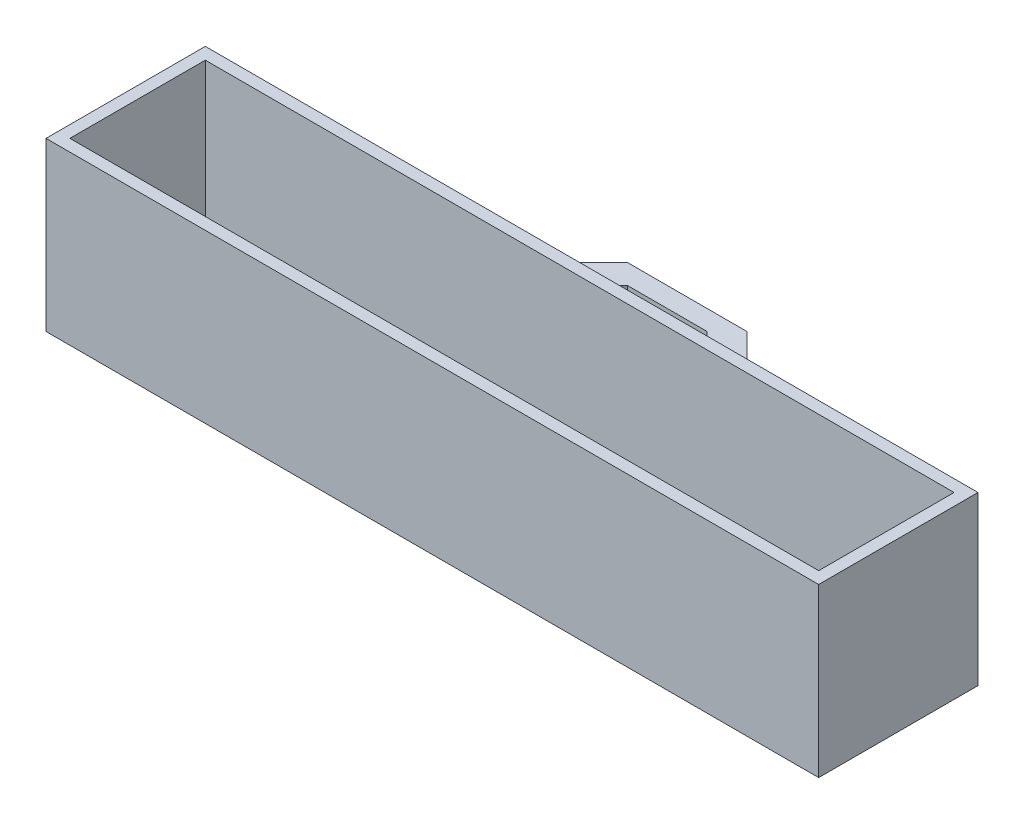
ISO-10303-21;
HEADER;
FILE_DESCRIPTION(('STEP AP214'),'2;1');
FILE_NAME('part.step','',(''),(''),'','','');
FILE_SCHEMA(('AUTOMOTIVE_DESIGN { 1 0 10303 214 1 1 1 1 }'));
ENDSEC;
DATA;
#1=APPLICATION_CONTEXT('core data for automotive mechanical design processes');
#2=APPLICATION_PROTOCOL_DEFINITION('international standard','automotive_design',2000,#1);
#3=PRODUCT_CONTEXT('',#1,'mechanical');
#4=PRODUCT('Part','Part','',(#3));
#5=PRODUCT_RELATED_PRODUCT_CATEGORY('part','',(#4));
#6=PRODUCT_DEFINITION_FORMATION('','',#4);
#7=PRODUCT_DEFINITION_CONTEXT('part definition',#1,'design');
#8=PRODUCT_DEFINITION('design','',#6,#7);
#9=PRODUCT_DEFINITION_SHAPE('','',#8);
#10=(LENGTH_UNIT() NAMED_UNIT(*) SI_UNIT(.MILLI.,.METRE.));
#11=(NAMED_UNIT(*) PLANE_ANGLE_UNIT() SI_UNIT($,.RADIAN.));
#12=(NAMED_UNIT(*) SI_UNIT($,.STERADIAN.) SOLID_ANGLE_UNIT());
#13=UNCERTAINTY_MEASURE_WITH_UNIT(LENGTH_MEASURE(1.E-05),#10,'distance_accuracy_value','');
#14=(GEOMETRIC_REPRESENTATION_CONTEXT(3) GLOBAL_UNCERTAINTY_ASSIGNED_CONTEXT((#13)) GLOBAL_UNIT_ASSIGNED_CONTEXT((#10,
#11,#12)) REPRESENTATION_CONTEXT('',''));
#15=CARTESIAN_POINT('',(0.,0.,0.));
#16=DIRECTION('',(0.,0.,1.));
#17=DIRECTION('',(1.,0.,0.));
#18=AXIS2_PLACEMENT_3D('',#15,#16,#17);
#19=CARTESIAN_POINT('',(-485.,200.,-100.));
#20=DIRECTION('',(0.,0.,1.));
#21=DIRECTION('',(1.,0.,0.));
#22=AXIS2_PLACEMENT_3D('',#19,#20,#21);
#23=PLANE('',#22);
#24=DIRECTION('',(1.,0.,0.));
#25=VECTOR('',#24,1.);
#26=CARTESIAN_POINT('',(-99.9999999999998,70.,-100.));
#27=LINE('',#26,#25);
#28=CARTESIAN_POINT('',(-135.,70.,-100.));
#29=VERTEX_POINT('',#28);
#30=CARTESIAN_POINT('',(-89.9999999999998,70.,-100.));
#31=VERTEX_POINT('',#30);
#32=EDGE_CURVE('E293',#29,#31,#27,.T.);
#33=ORIENTED_EDGE('',*,*,#32,.T.);
#34=DIRECTION('',(0.,1.,0.));
#35=VECTOR('',#34,1.);
#36=CARTESIAN_POINT('',(-89.9999999999998,110.,-100.));
#37=LINE('',#36,#35);
#38=CARTESIAN_POINT('',(-89.9999999999998,120.,-100.));
#39=VERTEX_POINT('',#38);
#40=EDGE_CURVE('E299',#31,#39,#37,.T.);
#41=ORIENTED_EDGE('',*,*,#40,.T.);
#42=DIRECTION('',(-1.,0.,0.));
#43=VECTOR('',#42,1.);
#44=CARTESIAN_POINT('',(-125.,120.,-100.));
#45=LINE('',#44,#43);
#46=CARTESIAN_POINT('',(-135.,120.,-100.));
#47=VERTEX_POINT('',#46);
#48=EDGE_CURVE('E297',#39,#47,#45,.T.);
#49=ORIENTED_EDGE('',*,*,#48,.T.);
#50=DIRECTION('',(0.,-1.,0.));
#51=VECTOR('',#50,1.);
#52=CARTESIAN_POINT('',(-135.,80.,-100.));
#53=LINE('',#52,#51);
#54=EDGE_CURVE('E295',#47,#29,#53,.T.);
#55=ORIENTED_EDGE('',*,*,#54,.T.);
#56=EDGE_LOOP('',(#33,#41,#49,#55));
#57=FACE_BOUND('',#56,.T.);
#58=DIRECTION('',(-1.,0.,0.));
#59=VECTOR('',#58,1.);
#60=CARTESIAN_POINT('',(100.,120.,-100.));
#61=LINE('',#60,#59);
#62=CARTESIAN_POINT('',(135.,120.,-100.));
#63=VERTEX_POINT('',#62);
#64=CARTESIAN_POINT('',(90.0000000000001,120.,-100.));
#65=VERTEX_POINT('',#64);
#66=EDGE_CURVE('E284',#63,#65,#61,.T.);
#67=ORIENTED_EDGE('',*,*,#66,.T.);
#68=DIRECTION('',(0.,-1.,0.));
#69=VECTOR('',#68,1.);
#70=CARTESIAN_POINT('',(90.0000000000001,80.,-100.));
#71=LINE('',#70,#69);
#72=CARTESIAN_POINT('',(90.0000000000001,70.,-100.));
#73=VERTEX_POINT('',#72);
#74=EDGE_CURVE('E290',#65,#73,#71,.T.);
#75=ORIENTED_EDGE('',*,*,#74,.T.);
#76=DIRECTION('',(1.,0.,0.));
#77=VECTOR('',#76,1.);
#78=CARTESIAN_POINT('',(125.,70.,-100.));
#79=LINE('',#78,#77);
#80=CARTESIAN_POINT('',(135.,70.,-100.));
#81=VERTEX_POINT('',#80);
#82=EDGE_CURVE('E288',#73,#81,#79,.T.);
#83=ORIENTED_EDGE('',*,*,#82,.T.);
#84=DIRECTION('',(0.,1.,0.));
#85=VECTOR('',#84,1.);
#86=CARTESIAN_POINT('',(135.,110.,-100.));
#87=LINE('',#86,#85);
#88=EDGE_CURVE('E286',#81,#63,#87,.T.);
#89=ORIENTED_EDGE('',*,*,#88,.T.);
#90=EDGE_LOOP('',(#67,#75,#83,#89));
#91=FACE_BOUND('',#90,.T.);
#92=DIRECTION('',(0.,-1.,0.));
#93=VECTOR('',#92,1.);
#94=CARTESIAN_POINT('',(485.,200.,-100.));
#95=LINE('',#94,#93);
#96=CARTESIAN_POINT('',(485.,200.,-100.));
#97=VERTEX_POINT('',#96);
#98=CARTESIAN_POINT('',(485.,-10.,-100.));
#99=VERTEX_POINT('',#98);
#100=EDGE_CURVE('E212',#97,#99,#95,.T.);
#101=ORIENTED_EDGE('',*,*,#100,.T.);
#102=DIRECTION('',(1.,0.,0.));
#103=VECTOR('',#102,1.);
#104=CARTESIAN_POINT('',(-485.,-10.,-100.));
#105=LINE('',#104,#103);
#106=CARTESIAN_POINT('',(-485.,-10.,-100.));
#107=VERTEX_POINT('',#106);
#108=EDGE_CURVE('E216',#107,#99,#105,.T.);
#109=ORIENTED_EDGE('',*,*,#108,.F.);
#110=DIRECTION('',(0.,-1.,0.));
#111=VECTOR('',#110,1.);
#112=CARTESIAN_POINT('',(-485.,200.,-100.));
#113=LINE('',#112,#111);
#114=CARTESIAN_POINT('',(-485.,200.,-100.));
#115=VERTEX_POINT('',#114);
#116=EDGE_CURVE('E204',#115,#107,#113,.T.);
#117=ORIENTED_EDGE('',*,*,#116,.F.);
#118=DIRECTION('',(-1.,0.,0.));
#119=VECTOR('',#118,1.);
#120=CARTESIAN_POINT('',(-485.,200.,-100.));
#121=LINE('',#120,#119);
#122=EDGE_CURVE('E268',#97,#115,#121,.T.);
#123=ORIENTED_EDGE('',*,*,#122,.F.);
#124=EDGE_LOOP('',(#101,#109,#117,#123));
#125=FACE_BOUND('',#124,.T.);
#126=ADVANCED_FACE('F40',(#57,#91,#125),#23,.F.);
#127=CARTESIAN_POINT('',(0.,200.,0.));
#128=DIRECTION('',(0.,1.,0.));
#129=DIRECTION('',(0.,0.,1.));
#130=AXIS2_PLACEMENT_3D('',#127,#128,#129);
#131=PLANE('',#130);
#132=DIRECTION('',(0.,0.,-1.));
#133=VECTOR('',#132,1.);
#134=CARTESIAN_POINT('',(485.,200.,-100.));
#135=LINE('',#134,#133);
#136=CARTESIAN_POINT('',(485.,200.,100.));
#137=VERTEX_POINT('',#136);
#138=EDGE_CURVE('E265',#137,#97,#135,.T.);
#139=ORIENTED_EDGE('',*,*,#138,.T.);
#140=ORIENTED_EDGE('',*,*,#122,.T.);
#141=DIRECTION('',(0.,0.,1.));
#142=VECTOR('',#141,1.);
#143=CARTESIAN_POINT('',(-485.,200.,-100.));
#144=LINE('',#143,#142);
#145=CARTESIAN_POINT('',(-485.,200.,100.));
#146=VERTEX_POINT('',#145);
#147=EDGE_CURVE('E210',#115,#146,#144,.T.);
#148=ORIENTED_EDGE('',*,*,#147,.T.);
#149=DIRECTION('',(1.,0.,0.));
#150=VECTOR('',#149,1.);
#151=CARTESIAN_POINT('',(-485.,200.,100.));
#152=LINE('',#151,#150);
#153=EDGE_CURVE('E271',#146,#137,#152,.T.);
#154=ORIENTED_EDGE('',*,*,#153,.T.);
#155=EDGE_LOOP('',(#139,#140,#148,#154));
#156=FACE_BOUND('',#155,.T.);
#157=DIRECTION('',(0.,0.,1.));
#158=VECTOR('',#157,1.);
#159=CARTESIAN_POINT('',(-470.,200.,-85.));
#160=LINE('',#159,#158);
#161=CARTESIAN_POINT('',(-470.,200.,-85.));
#162=VERTEX_POINT('',#161);
#163=CARTESIAN_POINT('',(-470.,200.,85.));
#164=VERTEX_POINT('',#163);
#165=EDGE_CURVE('E238',#162,#164,#160,.T.);
#166=ORIENTED_EDGE('',*,*,#165,.F.);
#167=DIRECTION('',(-1.,0.,0.));
#168=VECTOR('',#167,1.);
#169=CARTESIAN_POINT('',(-470.,200.,-85.));
#170=LINE('',#169,#168);
#171=CARTESIAN_POINT('',(470.,200.,-85.));
#172=VERTEX_POINT('',#171);
#173=EDGE_CURVE('E236',#172,#162,#170,.T.);
#174=ORIENTED_EDGE('',*,*,#173,.F.);
#175=DIRECTION('',(0.,0.,-1.));
#176=VECTOR('',#175,1.);
#177=CARTESIAN_POINT('',(470.,200.,-85.));
#178=LINE('',#177,#176);
#179=CARTESIAN_POINT('',(470.,200.,85.));
#180=VERTEX_POINT('',#179);
#181=EDGE_CURVE('E244',#180,#172,#178,.T.);
#182=ORIENTED_EDGE('',*,*,#181,.F.);
#183=DIRECTION('',(1.,0.,0.));
#184=VECTOR('',#183,1.);
#185=CARTESIAN_POINT('',(-470.,200.,85.));
#186=LINE('',#185,#184);
#187=EDGE_CURVE('E241',#164,#180,#186,.T.);
#188=ORIENTED_EDGE('',*,*,#187,.F.);
#189=EDGE_LOOP('',(#166,#174,#182,#188));
#190=FACE_BOUND('',#189,.T.);
#191=ADVANCED_FACE('F483',(#156,#190),#131,.T.);
#192=CARTESIAN_POINT('',(485.,200.,-100.));
#193=DIRECTION('',(-1.,0.,0.));
#194=DIRECTION('',(0.,0.,1.));
#195=AXIS2_PLACEMENT_3D('',#192,#193,#194);
#196=PLANE('',#195);
#197=DIRECTION('',(0.,-1.,0.));
#198=VECTOR('',#197,1.);
#199=CARTESIAN_POINT('',(485.,200.,100.));
#200=LINE('',#199,#198);
#201=CARTESIAN_POINT('',(485.,-10.,100.));
#202=VERTEX_POINT('',#201);
#203=EDGE_CURVE('E273',#137,#202,#200,.T.);
#204=ORIENTED_EDGE('',*,*,#203,.T.);
#205=DIRECTION('',(0.,0.,1.));
#206=VECTOR('',#205,1.);
#207=CARTESIAN_POINT('',(485.,-10.,100.));
#208=LINE('',#207,#206);
#209=EDGE_CURVE('E221',#99,#202,#208,.T.);
#210=ORIENTED_EDGE('',*,*,#209,.F.);
#211=ORIENTED_EDGE('',*,*,#100,.F.);
#212=ORIENTED_EDGE('',*,*,#138,.F.);
#213=EDGE_LOOP('',(#204,#210,#211,#212));
#214=FACE_BOUND('',#213,.T.);
#215=ADVANCED_FACE('F488',(#214),#196,.F.);
#216=CARTESIAN_POINT('',(-485.,200.,-100.));
#217=DIRECTION('',(1.,0.,0.));
#218=DIRECTION('',(0.,0.,-1.));
#219=AXIS2_PLACEMENT_3D('',#216,#217,#218);
#220=PLANE('',#219);
#221=ORIENTED_EDGE('',*,*,#116,.T.);
#222=DIRECTION('',(0.,0.,-1.));
#223=VECTOR('',#222,1.);
#224=CARTESIAN_POINT('',(-485.,-10.,100.));
#225=LINE('',#224,#223);
#226=CARTESIAN_POINT('',(-485.,-10.,100.));
#227=VERTEX_POINT('',#226);
#228=EDGE_CURVE('E209',#227,#107,#225,.T.);
#229=ORIENTED_EDGE('',*,*,#228,.F.);
#230=DIRECTION('',(0.,-1.,0.));
#231=VECTOR('',#230,1.);
#232=CARTESIAN_POINT('',(-485.,200.,100.));
#233=LINE('',#232,#231);
#234=EDGE_CURVE('E213',#146,#227,#233,.T.);
#235=ORIENTED_EDGE('',*,*,#234,.F.);
#236=ORIENTED_EDGE('',*,*,#147,.F.);
#237=EDGE_LOOP('',(#221,#229,#235,#236));
#238=FACE_BOUND('',#237,.T.);
#239=ADVANCED_FACE('F206',(#238),#220,.F.);
#240=CARTESIAN_POINT('',(-485.,200.,100.));
#241=DIRECTION('',(0.,0.,-1.));
#242=DIRECTION('',(-1.,0.,0.));
#243=AXIS2_PLACEMENT_3D('',#240,#241,#242);
#244=PLANE('',#243);
#245=ORIENTED_EDGE('',*,*,#234,.T.);
#246=DIRECTION('',(-1.,0.,0.));
#247=VECTOR('',#246,1.);
#248=CARTESIAN_POINT('',(-485.,-10.,100.));
#249=LINE('',#248,#247);
#250=EDGE_CURVE('E226',#202,#227,#249,.T.);
#251=ORIENTED_EDGE('',*,*,#250,.F.);
#252=ORIENTED_EDGE('',*,*,#203,.F.);
#253=ORIENTED_EDGE('',*,*,#153,.F.);
#254=EDGE_LOOP('',(#245,#251,#252,#253));
#255=FACE_BOUND('',#254,.T.);
#256=ADVANCED_FACE('F727',(#255),#244,.F.);
#257=CARTESIAN_POINT('',(-470.,200.,-85.));
#258=DIRECTION('',(0.,0.,1.));
#259=DIRECTION('',(1.,0.,0.));
#260=AXIS2_PLACEMENT_3D('',#257,#258,#259);
#261=PLANE('',#260);
#262=DIRECTION('',(-1.,0.,0.));
#263=VECTOR('',#262,1.);
#264=CARTESIAN_POINT('',(-470.,0.,-85.));
#265=LINE('',#264,#263);
#266=CARTESIAN_POINT('',(470.,0.,-85.));
#267=VERTEX_POINT('',#266);
#268=CARTESIAN_POINT('',(-470.,0.,-85.));
#269=VERTEX_POINT('',#268);
#270=EDGE_CURVE('E235',#267,#269,#265,.T.);
#271=ORIENTED_EDGE('',*,*,#270,.F.);
#272=DIRECTION('',(0.,-1.,0.));
#273=VECTOR('',#272,1.);
#274=CARTESIAN_POINT('',(470.,200.,-85.));
#275=LINE('',#274,#273);
#276=EDGE_CURVE('E246',#172,#267,#275,.T.);
#277=ORIENTED_EDGE('',*,*,#276,.F.);
#278=ORIENTED_EDGE('',*,*,#173,.T.);
#279=DIRECTION('',(0.,-1.,0.));
#280=VECTOR('',#279,1.);
#281=CARTESIAN_POINT('',(-470.,200.,-85.));
#282=LINE('',#281,#280);
#283=EDGE_CURVE('E262',#162,#269,#282,.T.);
#284=ORIENTED_EDGE('',*,*,#283,.T.);
#285=EDGE_LOOP('',(#271,#277,#278,#284));
#286=FACE_BOUND('',#285,.T.);
#287=ADVANCED_FACE('F734',(#286),#261,.T.);
#288=CARTESIAN_POINT('',(-470.,200.,-85.));
#289=DIRECTION('',(1.,0.,0.));
#290=DIRECTION('',(0.,0.,-1.));
#291=AXIS2_PLACEMENT_3D('',#288,#289,#290);
#292=PLANE('',#291);
#293=DIRECTION('',(0.,0.,1.));
#294=VECTOR('',#293,1.);
#295=CARTESIAN_POINT('',(-470.,0.,-85.));
#296=LINE('',#295,#294);
#297=CARTESIAN_POINT('',(-470.,0.,85.));
#298=VERTEX_POINT('',#297);
#299=EDGE_CURVE('E249',#269,#298,#296,.T.);
#300=ORIENTED_EDGE('',*,*,#299,.F.);
#301=ORIENTED_EDGE('',*,*,#283,.F.);
#302=ORIENTED_EDGE('',*,*,#165,.T.);
#303=DIRECTION('',(0.,-1.,0.));
#304=VECTOR('',#303,1.);
#305=CARTESIAN_POINT('',(-470.,200.,85.));
#306=LINE('',#305,#304);
#307=EDGE_CURVE('E260',#164,#298,#306,.T.);
#308=ORIENTED_EDGE('',*,*,#307,.T.);
#309=EDGE_LOOP('',(#300,#301,#302,#308));
#310=FACE_BOUND('',#309,.T.);
#311=ADVANCED_FACE('F778',(#310),#292,.T.);
#312=CARTESIAN_POINT('',(-470.,200.,85.));
#313=DIRECTION('',(0.,0.,-1.));
#314=DIRECTION('',(-1.,0.,0.));
#315=AXIS2_PLACEMENT_3D('',#312,#313,#314);
#316=PLANE('',#315);
#317=DIRECTION('',(1.,0.,0.));
#318=VECTOR('',#317,1.);
#319=CARTESIAN_POINT('',(-470.,0.,85.));
#320=LINE('',#319,#318);
#321=CARTESIAN_POINT('',(470.,0.,85.));
#322=VERTEX_POINT('',#321);
#323=EDGE_CURVE('E252',#298,#322,#320,.T.);
#324=ORIENTED_EDGE('',*,*,#323,.F.);
#325=ORIENTED_EDGE('',*,*,#307,.F.);
#326=ORIENTED_EDGE('',*,*,#187,.T.);
#327=DIRECTION('',(0.,-1.,0.));
#328=VECTOR('',#327,1.);
#329=CARTESIAN_POINT('',(470.,200.,85.));
#330=LINE('',#329,#328);
#331=EDGE_CURVE('E258',#180,#322,#330,.T.);
#332=ORIENTED_EDGE('',*,*,#331,.T.);
#333=EDGE_LOOP('',(#324,#325,#326,#332));
#334=FACE_BOUND('',#333,.T.);
#335=ADVANCED_FACE('F767',(#334),#316,.T.);
#336=CARTESIAN_POINT('',(470.,200.,-85.));
#337=DIRECTION('',(-1.,0.,0.));
#338=DIRECTION('',(0.,0.,1.));
#339=AXIS2_PLACEMENT_3D('',#336,#337,#338);
#340=PLANE('',#339);
#341=DIRECTION('',(0.,0.,-1.));
#342=VECTOR('',#341,1.);
#343=CARTESIAN_POINT('',(470.,0.,-85.));
#344=LINE('',#343,#342);
#345=EDGE_CURVE('E239',#322,#267,#344,.T.);
#346=ORIENTED_EDGE('',*,*,#345,.F.);
#347=ORIENTED_EDGE('',*,*,#331,.F.);
#348=ORIENTED_EDGE('',*,*,#181,.T.);
#349=ORIENTED_EDGE('',*,*,#276,.T.);
#350=EDGE_LOOP('',(#346,#347,#348,#349));
#351=FACE_BOUND('',#350,.T.);
#352=ADVANCED_FACE('F720',(#351),#340,.T.);
#353=CARTESIAN_POINT('',(0.,0.,0.));
#354=DIRECTION('',(0.,-1.,0.));
#355=DIRECTION('',(0.,0.,-1.));
#356=AXIS2_PLACEMENT_3D('',#353,#354,#355);
#357=PLANE('',#356);
#358=ORIENTED_EDGE('',*,*,#345,.T.);
#359=ORIENTED_EDGE('',*,*,#270,.T.);
#360=ORIENTED_EDGE('',*,*,#299,.T.);
#361=ORIENTED_EDGE('',*,*,#323,.T.);
#362=EDGE_LOOP('',(#358,#359,#360,#361));
#363=FACE_BOUND('',#362,.T.);
#364=ADVANCED_FACE('F710',(#363),#357,.F.);
#365=CARTESIAN_POINT('',(0.,-10.,0.));
#366=DIRECTION('',(0.,-1.,0.));
#367=DIRECTION('',(0.,0.,-1.));
#368=AXIS2_PLACEMENT_3D('',#365,#366,#367);
#369=PLANE('',#368);
#370=ORIENTED_EDGE('',*,*,#228,.T.);
#371=ORIENTED_EDGE('',*,*,#108,.T.);
#372=ORIENTED_EDGE('',*,*,#209,.T.);
#373=ORIENTED_EDGE('',*,*,#250,.T.);
#374=EDGE_LOOP('',(#370,#371,#372,#373));
#375=FACE_BOUND('',#374,.T.);
#376=ADVANCED_FACE('F224',(#375),#369,.T.);
#377=CARTESIAN_POINT('',(-125.,110.,-220.));
#378=DIRECTION('',(1.,0.,0.));
#379=DIRECTION('',(0.,0.,-1.));
#380=AXIS2_PLACEMENT_3D('',#377,#378,#379);
#381=PLANE('',#380);
#382=DIRECTION('',(0.,0.,1.));
#383=VECTOR('',#382,1.);
#384=CARTESIAN_POINT('',(-125.,110.,-220.));
#385=LINE('',#384,#383);
#386=CARTESIAN_POINT('',(-125.,110.,-170.));
#387=VERTEX_POINT('',#386);
#388=CARTESIAN_POINT('',(-125.,110.,-110.));
#389=VERTEX_POINT('',#388);
#390=EDGE_CURVE('E227',#387,#389,#385,.T.);
#391=ORIENTED_EDGE('',*,*,#390,.F.);
#392=DIRECTION('',(0.,-1.,0.));
#393=VECTOR('',#392,1.);
#394=CARTESIAN_POINT('',(-125.,80.,-170.));
#395=LINE('',#394,#393);
#396=CARTESIAN_POINT('',(-125.,80.,-170.));
#397=VERTEX_POINT('',#396);
#398=EDGE_CURVE('E355',#387,#397,#395,.T.);
#399=ORIENTED_EDGE('',*,*,#398,.T.);
#400=DIRECTION('',(0.,0.,1.));
#401=VECTOR('',#400,1.);
#402=CARTESIAN_POINT('',(-125.,80.,-220.));
#403=LINE('',#402,#401);
#404=CARTESIAN_POINT('',(-125.,80.,-110.));
#405=VERTEX_POINT('',#404);
#406=EDGE_CURVE('E397',#397,#405,#403,.T.);
#407=ORIENTED_EDGE('',*,*,#406,.T.);
#408=DIRECTION('',(0.,1.,0.));
#409=VECTOR('',#408,1.);
#410=CARTESIAN_POINT('',(-125.,110.,-110.));
#411=LINE('',#410,#409);
#412=EDGE_CURVE('E311',#405,#389,#411,.T.);
#413=ORIENTED_EDGE('',*,*,#412,.T.);
#414=EDGE_LOOP('',(#391,#399,#407,#413));
#415=FACE_BOUND('',#414,.T.);
#416=ADVANCED_FACE('F386',(#415),#381,.F.);
#417=CARTESIAN_POINT('',(125.,110.,-220.));
#418=DIRECTION('',(0.,-1.,0.));
#419=DIRECTION('',(0.,0.,-1.));
#420=AXIS2_PLACEMENT_3D('',#417,#418,#419);
#421=PLANE('',#420);
#422=DIRECTION('',(0.,0.,1.));
#423=VECTOR('',#422,1.);
#424=CARTESIAN_POINT('',(125.,110.,-220.));
#425=LINE('',#424,#423);
#426=CARTESIAN_POINT('',(125.,110.,-170.));
#427=VERTEX_POINT('',#426);
#428=CARTESIAN_POINT('',(125.,110.,-110.));
#429=VERTEX_POINT('',#428);
#430=EDGE_CURVE('E229',#427,#429,#425,.T.);
#431=ORIENTED_EDGE('',*,*,#430,.F.);
#432=DIRECTION('',(-0.707106781186547,0.,-0.707106781186548));
#433=VECTOR('',#432,1.);
#434=CARTESIAN_POINT('',(75.0000000000003,110.,-220.));
#435=LINE('',#434,#433);
#436=CARTESIAN_POINT('',(75.0000000000003,110.,-220.));
#437=VERTEX_POINT('',#436);
#438=EDGE_CURVE('E11',#427,#437,#435,.T.);
#439=ORIENTED_EDGE('',*,*,#438,.T.);
#440=DIRECTION('',(1.,0.,0.));
#441=VECTOR('',#440,1.);
#442=CARTESIAN_POINT('',(125.,110.,-220.));
#443=LINE('',#442,#441);
#444=CARTESIAN_POINT('',(-75.,110.,-220.));
#445=VERTEX_POINT('',#444);
#446=EDGE_CURVE('E381',#445,#437,#443,.T.);
#447=ORIENTED_EDGE('',*,*,#446,.F.);
#448=DIRECTION('',(-0.707106781186547,0.,0.707106781186548));
#449=VECTOR('',#448,1.);
#450=CARTESIAN_POINT('',(-75.,110.,-220.));
#451=LINE('',#450,#449);
#452=EDGE_CURVE('E49',#445,#387,#451,.T.);
#453=ORIENTED_EDGE('',*,*,#452,.T.);
#454=ORIENTED_EDGE('',*,*,#390,.T.);
#455=DIRECTION('',(1.,0.,0.));
#456=VECTOR('',#455,1.);
#457=CARTESIAN_POINT('',(-99.9999999999998,110.,-110.));
#458=LINE('',#457,#456);
#459=CARTESIAN_POINT('',(-99.9999999999998,110.,-110.));
#460=VERTEX_POINT('',#459);
#461=EDGE_CURVE('E308',#389,#460,#458,.T.);
#462=ORIENTED_EDGE('',*,*,#461,.T.);
#463=DIRECTION('',(0.,0.,1.));
#464=VECTOR('',#463,1.);
#465=CARTESIAN_POINT('',(-99.9999999999998,110.,-100.));
#466=LINE('',#465,#464);
#467=CARTESIAN_POINT('',(-99.9999999999998,110.,-145.));
#468=VERTEX_POINT('',#467);
#469=EDGE_CURVE('E338',#468,#460,#466,.T.);
#470=ORIENTED_EDGE('',*,*,#469,.F.);
#471=DIRECTION('',(-0.707106781186544,0.,0.707106781186551));
#472=VECTOR('',#471,1.);
#473=CARTESIAN_POINT('',(49.999999999999,110.,-295.));
#474=LINE('',#473,#472);
#475=CARTESIAN_POINT('',(-50.0000000000002,110.,-195.));
#476=VERTEX_POINT('',#475);
#477=EDGE_CURVE('E366',#468,#476,#474,.F.);
#478=ORIENTED_EDGE('',*,*,#477,.T.);
#479=DIRECTION('',(-1.,0.,0.));
#480=VECTOR('',#479,1.);
#481=CARTESIAN_POINT('',(-99.9999999999999,110.,-195.));
#482=LINE('',#481,#480);
#483=CARTESIAN_POINT('',(49.9999999999998,110.,-195.));
#484=VERTEX_POINT('',#483);
#485=EDGE_CURVE('E404',#484,#476,#482,.T.);
#486=ORIENTED_EDGE('',*,*,#485,.F.);
#487=DIRECTION('',(-0.707106781186552,0.,-0.707106781186543));
#488=VECTOR('',#487,1.);
#489=CARTESIAN_POINT('',(75.0000000000005,110.,-170.));
#490=LINE('',#489,#488);
#491=CARTESIAN_POINT('',(100.,110.,-145.));
#492=VERTEX_POINT('',#491);
#493=EDGE_CURVE('E56',#484,#492,#490,.F.);
#494=ORIENTED_EDGE('',*,*,#493,.T.);
#495=DIRECTION('',(0.,0.,-1.));
#496=VECTOR('',#495,1.);
#497=CARTESIAN_POINT('',(100.,110.,-100.));
#498=LINE('',#497,#496);
#499=CARTESIAN_POINT('',(100.,110.,-110.));
#500=VERTEX_POINT('',#499);
#501=EDGE_CURVE('E416',#500,#492,#498,.T.);
#502=ORIENTED_EDGE('',*,*,#501,.F.);
#503=DIRECTION('',(1.,0.,0.));
#504=VECTOR('',#503,1.);
#505=CARTESIAN_POINT('',(125.,110.,-110.));
#506=LINE('',#505,#504);
#507=EDGE_CURVE('E305',#500,#429,#506,.T.);
#508=ORIENTED_EDGE('',*,*,#507,.T.);
#509=EDGE_LOOP('',(#431,#439,#447,#453,#454,#462,#470,#478,#486,#494,#502,#508));
#510=FACE_BOUND('',#509,.T.);
#511=ADVANCED_FACE('F379',(#510),#421,.F.);
#512=CARTESIAN_POINT('',(125.,110.,-220.));
#513=DIRECTION('',(-1.,0.,0.));
#514=DIRECTION('',(0.,0.,1.));
#515=AXIS2_PLACEMENT_3D('',#512,#513,#514);
#516=PLANE('',#515);
#517=DIRECTION('',(0.,0.,1.));
#518=VECTOR('',#517,1.);
#519=CARTESIAN_POINT('',(125.,80.,-220.));
#520=LINE('',#519,#518);
#521=CARTESIAN_POINT('',(125.,80.,-170.));
#522=VERTEX_POINT('',#521);
#523=CARTESIAN_POINT('',(125.,80.,-110.));
#524=VERTEX_POINT('',#523);
#525=EDGE_CURVE('E402',#522,#524,#520,.T.);
#526=ORIENTED_EDGE('',*,*,#525,.F.);
#527=DIRECTION('',(0.,1.,0.));
#528=VECTOR('',#527,1.);
#529=CARTESIAN_POINT('',(125.,110.,-170.));
#530=LINE('',#529,#528);
#531=EDGE_CURVE('E353',#522,#427,#530,.T.);
#532=ORIENTED_EDGE('',*,*,#531,.T.);
#533=ORIENTED_EDGE('',*,*,#430,.T.);
#534=DIRECTION('',(0.,-1.,0.));
#535=VECTOR('',#534,1.);
#536=CARTESIAN_POINT('',(125.,80.,-110.));
#537=LINE('',#536,#535);
#538=EDGE_CURVE('E322',#429,#524,#537,.T.);
#539=ORIENTED_EDGE('',*,*,#538,.T.);
#540=EDGE_LOOP('',(#526,#532,#533,#539));
#541=FACE_BOUND('',#540,.T.);
#542=ADVANCED_FACE('F410',(#541),#516,.F.);
#543=CARTESIAN_POINT('',(125.,80.,-220.));
#544=DIRECTION('',(0.,1.,0.));
#545=DIRECTION('',(0.,0.,1.));
#546=AXIS2_PLACEMENT_3D('',#543,#544,#545);
#547=PLANE('',#546);
#548=DIRECTION('',(-1.,0.,0.));
#549=VECTOR('',#548,1.);
#550=CARTESIAN_POINT('',(125.,80.,-220.));
#551=LINE('',#550,#549);
#552=CARTESIAN_POINT('',(75.0000000000003,80.,-220.));
#553=VERTEX_POINT('',#552);
#554=CARTESIAN_POINT('',(-75.,80.,-220.));
#555=VERTEX_POINT('',#554);
#556=EDGE_CURVE('E396',#553,#555,#551,.T.);
#557=ORIENTED_EDGE('',*,*,#556,.F.);
#558=DIRECTION('',(0.707106781186547,0.,0.707106781186548));
#559=VECTOR('',#558,1.);
#560=CARTESIAN_POINT('',(75.0000000000003,80.,-220.));
#561=LINE('',#560,#559);
#562=EDGE_CURVE('E375',#553,#522,#561,.T.);
#563=ORIENTED_EDGE('',*,*,#562,.T.);
#564=ORIENTED_EDGE('',*,*,#525,.T.);
#565=DIRECTION('',(-1.,0.,0.));
#566=VECTOR('',#565,1.);
#567=CARTESIAN_POINT('',(100.,80.,-110.));
#568=LINE('',#567,#566);
#569=CARTESIAN_POINT('',(100.,80.,-110.));
#570=VERTEX_POINT('',#569);
#571=EDGE_CURVE('E314',#524,#570,#568,.T.);
#572=ORIENTED_EDGE('',*,*,#571,.T.);
#573=DIRECTION('',(0.,0.,-1.));
#574=VECTOR('',#573,1.);
#575=CARTESIAN_POINT('',(100.,80.,-220.));
#576=LINE('',#575,#574);
#577=CARTESIAN_POINT('',(100.,80.,-145.));
#578=VERTEX_POINT('',#577);
#579=EDGE_CURVE('E277',#570,#578,#576,.T.);
#580=ORIENTED_EDGE('',*,*,#579,.T.);
#581=DIRECTION('',(0.707106781186552,0.,0.707106781186543));
#582=VECTOR('',#581,1.);
#583=CARTESIAN_POINT('',(75.0000000000005,80.,-170.));
#584=LINE('',#583,#582);
#585=CARTESIAN_POINT('',(49.9999999999998,80.,-195.));
#586=VERTEX_POINT('',#585);
#587=EDGE_CURVE('E371',#578,#586,#584,.F.);
#588=ORIENTED_EDGE('',*,*,#587,.T.);
#589=DIRECTION('',(-1.,0.,0.));
#590=VECTOR('',#589,1.);
#591=CARTESIAN_POINT('',(125.,80.,-195.));
#592=LINE('',#591,#590);
#593=CARTESIAN_POINT('',(-50.0000000000002,80.,-195.));
#594=VERTEX_POINT('',#593);
#595=EDGE_CURVE('E279',#586,#594,#592,.T.);
#596=ORIENTED_EDGE('',*,*,#595,.T.);
#597=DIRECTION('',(0.707106781186544,0.,-0.707106781186551));
#598=VECTOR('',#597,1.);
#599=CARTESIAN_POINT('',(49.999999999999,80.,-295.));
#600=LINE('',#599,#598);
#601=CARTESIAN_POINT('',(-99.9999999999999,80.,-145.));
#602=VERTEX_POINT('',#601);
#603=EDGE_CURVE('E368',#594,#602,#600,.F.);
#604=ORIENTED_EDGE('',*,*,#603,.T.);
#605=DIRECTION('',(0.,0.,1.));
#606=VECTOR('',#605,1.);
#607=CARTESIAN_POINT('',(-99.9999999999999,80.,-220.));
#608=LINE('',#607,#606);
#609=CARTESIAN_POINT('',(-99.9999999999998,80.,-110.));
#610=VERTEX_POINT('',#609);
#611=EDGE_CURVE('E282',#602,#610,#608,.T.);
#612=ORIENTED_EDGE('',*,*,#611,.T.);
#613=DIRECTION('',(-1.,0.,0.));
#614=VECTOR('',#613,1.);
#615=CARTESIAN_POINT('',(-125.,80.,-110.));
#616=LINE('',#615,#614);
#617=EDGE_CURVE('E316',#610,#405,#616,.T.);
#618=ORIENTED_EDGE('',*,*,#617,.T.);
#619=ORIENTED_EDGE('',*,*,#406,.F.);
#620=DIRECTION('',(0.707106781186547,0.,-0.707106781186548));
#621=VECTOR('',#620,1.);
#622=CARTESIAN_POINT('',(-75.,80.,-220.));
#623=LINE('',#622,#621);
#624=EDGE_CURVE('E373',#397,#555,#623,.T.);
#625=ORIENTED_EDGE('',*,*,#624,.T.);
#626=EDGE_LOOP('',(#557,#563,#564,#572,#580,#588,#596,#604,#612,#618,#619,#625));
#627=FACE_BOUND('',#626,.T.);
#628=ADVANCED_FACE('F395',(#627),#547,.F.);
#629=CARTESIAN_POINT('',(0.,0.,-220.));
#630=DIRECTION('',(0.,0.,-1.));
#631=DIRECTION('',(-1.,0.,0.));
#632=AXIS2_PLACEMENT_3D('',#629,#630,#631);
#633=PLANE('',#632);
#634=ORIENTED_EDGE('',*,*,#446,.T.);
#635=DIRECTION('',(0.,-1.,0.));
#636=VECTOR('',#635,1.);
#637=CARTESIAN_POINT('',(75.0000000000003,80.,-220.));
#638=LINE('',#637,#636);
#639=EDGE_CURVE('E350',#437,#553,#638,.T.);
#640=ORIENTED_EDGE('',*,*,#639,.T.);
#641=ORIENTED_EDGE('',*,*,#556,.T.);
#642=DIRECTION('',(0.,1.,0.));
#643=VECTOR('',#642,1.);
#644=CARTESIAN_POINT('',(-75.,110.,-220.));
#645=LINE('',#644,#643);
#646=EDGE_CURVE('E325',#555,#445,#645,.T.);
#647=ORIENTED_EDGE('',*,*,#646,.T.);
#648=EDGE_LOOP('',(#634,#640,#641,#647));
#649=FACE_BOUND('',#648,.T.);
#650=ADVANCED_FACE('F399',(#649),#633,.T.);
#651=CARTESIAN_POINT('',(-99.9999999999998,-9.99999999999999,-100.));
#652=DIRECTION('',(-1.,0.,0.));
#653=DIRECTION('',(0.,0.,1.));
#654=AXIS2_PLACEMENT_3D('',#651,#652,#653);
#655=PLANE('',#654);
#656=ORIENTED_EDGE('',*,*,#611,.F.);
#657=DIRECTION('',(0.,1.,0.));
#658=VECTOR('',#657,1.);
#659=CARTESIAN_POINT('',(-99.9999999999998,110.,-145.));
#660=LINE('',#659,#658);
#661=EDGE_CURVE('E357',#602,#468,#660,.T.);
#662=ORIENTED_EDGE('',*,*,#661,.T.);
#663=ORIENTED_EDGE('',*,*,#469,.T.);
#664=DIRECTION('',(0.,-1.,0.));
#665=VECTOR('',#664,1.);
#666=CARTESIAN_POINT('',(-99.9999999999998,80.,-110.));
#667=LINE('',#666,#665);
#668=EDGE_CURVE('E302',#460,#610,#667,.T.);
#669=ORIENTED_EDGE('',*,*,#668,.T.);
#670=EDGE_LOOP('',(#656,#662,#663,#669));
#671=FACE_BOUND('',#670,.T.);
#672=ADVANCED_FACE('F451',(#671),#655,.F.);
#673=CARTESIAN_POINT('',(-99.9999999999999,-9.99999999999999,-195.));
#674=DIRECTION('',(0.,0.,-1.));
#675=DIRECTION('',(-1.,0.,0.));
#676=AXIS2_PLACEMENT_3D('',#673,#674,#675);
#677=PLANE('',#676);
#678=ORIENTED_EDGE('',*,*,#485,.T.);
#679=DIRECTION('',(0.,-1.,0.));
#680=VECTOR('',#679,1.);
#681=CARTESIAN_POINT('',(-50.0000000000002,80.,-195.));
#682=LINE('',#681,#680);
#683=EDGE_CURVE('E363',#476,#594,#682,.T.);
#684=ORIENTED_EDGE('',*,*,#683,.T.);
#685=ORIENTED_EDGE('',*,*,#595,.F.);
#686=DIRECTION('',(0.,1.,0.));
#687=VECTOR('',#686,1.);
#688=CARTESIAN_POINT('',(49.9999999999998,110.,-195.));
#689=LINE('',#688,#687);
#690=EDGE_CURVE('E360',#586,#484,#689,.T.);
#691=ORIENTED_EDGE('',*,*,#690,.T.);
#692=EDGE_LOOP('',(#678,#684,#685,#691));
#693=FACE_BOUND('',#692,.T.);
#694=ADVANCED_FACE('F444',(#693),#677,.F.);
#695=CARTESIAN_POINT('',(100.,-9.99999999999999,-100.));
#696=DIRECTION('',(1.,0.,0.));
#697=DIRECTION('',(0.,0.,-1.));
#698=AXIS2_PLACEMENT_3D('',#695,#696,#697);
#699=PLANE('',#698);
#700=ORIENTED_EDGE('',*,*,#501,.T.);
#701=DIRECTION('',(0.,-1.,0.));
#702=VECTOR('',#701,1.);
#703=CARTESIAN_POINT('',(100.,80.,-145.));
#704=LINE('',#703,#702);
#705=EDGE_CURVE('E63',#492,#578,#704,.T.);
#706=ORIENTED_EDGE('',*,*,#705,.T.);
#707=ORIENTED_EDGE('',*,*,#579,.F.);
#708=DIRECTION('',(0.,1.,0.));
#709=VECTOR('',#708,1.);
#710=CARTESIAN_POINT('',(100.,110.,-110.));
#711=LINE('',#710,#709);
#712=EDGE_CURVE('E319',#570,#500,#711,.T.);
#713=ORIENTED_EDGE('',*,*,#712,.T.);
#714=EDGE_LOOP('',(#700,#706,#707,#713));
#715=FACE_BOUND('',#714,.T.);
#716=ADVANCED_FACE('F436',(#715),#699,.F.);
#717=CARTESIAN_POINT('',(-125.,110.,-110.));
#718=DIRECTION('',(-0.707106781186552,0.,-0.707106781186542));
#719=DIRECTION('',(0.,-1.,0.));
#720=AXIS2_PLACEMENT_3D('',#717,#718,#719);
#721=PLANE('',#720);
#722=DIRECTION('',(0.577350269189623,-0.577350269189624,-0.577350269189631));
#723=VECTOR('',#722,1.);
#724=CARTESIAN_POINT('',(-125.,110.,-110.));
#725=LINE('',#724,#723);
#726=EDGE_CURVE('E332',#389,#47,#725,.F.);
#727=ORIENTED_EDGE('',*,*,#726,.F.);
#728=ORIENTED_EDGE('',*,*,#412,.F.);
#729=DIRECTION('',(0.577350269189623,0.577350269189624,-0.577350269189631));
#730=VECTOR('',#729,1.);
#731=CARTESIAN_POINT('',(-41.6666666666674,163.333333333333,-193.333333333334));
#732=LINE('',#731,#730);
#733=EDGE_CURVE('E335',#29,#405,#732,.T.);
#734=ORIENTED_EDGE('',*,*,#733,.F.);
#735=ORIENTED_EDGE('',*,*,#54,.F.);
#736=EDGE_LOOP('',(#727,#728,#734,#735));
#737=FACE_BOUND('',#736,.T.);
#738=ADVANCED_FACE('F471',(#737),#721,.T.);
#739=CARTESIAN_POINT('',(125.,80.,-110.));
#740=DIRECTION('',(0.,-0.707106781186552,-0.707106781186543));
#741=DIRECTION('',(1.,0.,0.));
#742=AXIS2_PLACEMENT_3D('',#739,#740,#741);
#743=PLANE('',#742);
#744=ORIENTED_EDGE('',*,*,#733,.T.);
#745=ORIENTED_EDGE('',*,*,#617,.F.);
#746=DIRECTION('',(0.577350269189624,-0.577350269189623,0.57735026918963));
#747=VECTOR('',#746,1.);
#748=CARTESIAN_POINT('',(-25.0000000000003,5.00000000000059,-34.9999999999998));
#749=LINE('',#748,#747);
#750=EDGE_CURVE('E328',#31,#610,#749,.F.);
#751=ORIENTED_EDGE('',*,*,#750,.F.);
#752=ORIENTED_EDGE('',*,*,#32,.F.);
#753=EDGE_LOOP('',(#744,#745,#751,#752));
#754=FACE_BOUND('',#753,.T.);
#755=ADVANCED_FACE('F469',(#754),#743,.T.);
#756=CARTESIAN_POINT('',(125.,110.,-110.));
#757=DIRECTION('',(0.,0.707106781186551,-0.707106781186543));
#758=DIRECTION('',(-1.,0.,0.));
#759=AXIS2_PLACEMENT_3D('',#756,#757,#758);
#760=PLANE('',#759);
#761=ORIENTED_EDGE('',*,*,#726,.T.);
#762=ORIENTED_EDGE('',*,*,#48,.F.);
#763=DIRECTION('',(-0.577350269189624,-0.577350269189624,-0.57735026918963));
#764=VECTOR('',#763,1.);
#765=CARTESIAN_POINT('',(-25.0000000000004,184.999999999999,-34.9999999999999));
#766=LINE('',#765,#764);
#767=EDGE_CURVE('E326',#460,#39,#766,.F.);
#768=ORIENTED_EDGE('',*,*,#767,.F.);
#769=ORIENTED_EDGE('',*,*,#461,.F.);
#770=EDGE_LOOP('',(#761,#762,#768,#769));
#771=FACE_BOUND('',#770,.T.);
#772=ADVANCED_FACE('F463',(#771),#760,.T.);
#773=CARTESIAN_POINT('',(-89.9999999999998,200.,-100.));
#774=DIRECTION('',(0.707106781186551,0.,-0.707106781186543));
#775=DIRECTION('',(0.,-1.,0.));
#776=AXIS2_PLACEMENT_3D('',#773,#774,#775);
#777=PLANE('',#776);
#778=ORIENTED_EDGE('',*,*,#750,.T.);
#779=ORIENTED_EDGE('',*,*,#668,.F.);
#780=ORIENTED_EDGE('',*,*,#767,.T.);
#781=ORIENTED_EDGE('',*,*,#40,.F.);
#782=EDGE_LOOP('',(#778,#779,#780,#781));
#783=FACE_BOUND('',#782,.T.);
#784=ADVANCED_FACE('F456',(#783),#777,.T.);
#785=CARTESIAN_POINT('',(125.,110.,-110.));
#786=DIRECTION('',(0.707106781186551,0.,-0.707106781186543));
#787=DIRECTION('',(0.,1.,0.));
#788=AXIS2_PLACEMENT_3D('',#785,#786,#787);
#789=PLANE('',#788);
#790=DIRECTION('',(-0.577350269189624,-0.577350269189624,-0.57735026918963));
#791=VECTOR('',#790,1.);
#792=CARTESIAN_POINT('',(125.,110.,-110.));
#793=LINE('',#792,#791);
#794=EDGE_CURVE('E343',#63,#429,#793,.T.);
#795=ORIENTED_EDGE('',*,*,#794,.F.);
#796=ORIENTED_EDGE('',*,*,#88,.F.);
#797=DIRECTION('',(-0.577350269189624,0.577350269189623,-0.57735026918963));
#798=VECTOR('',#797,1.);
#799=CARTESIAN_POINT('',(115.,89.9999999999999,-120.));
#800=LINE('',#799,#798);
#801=EDGE_CURVE('E329',#524,#81,#800,.F.);
#802=ORIENTED_EDGE('',*,*,#801,.F.);
#803=ORIENTED_EDGE('',*,*,#538,.F.);
#804=EDGE_LOOP('',(#795,#796,#802,#803));
#805=FACE_BOUND('',#804,.T.);
#806=ADVANCED_FACE('F421',(#805),#789,.T.);
#807=CARTESIAN_POINT('',(125.,80.,-110.));
#808=DIRECTION('',(0.,-0.707106781186552,-0.707106781186543));
#809=DIRECTION('',(1.,0.,0.));
#810=AXIS2_PLACEMENT_3D('',#807,#808,#809);
#811=PLANE('',#810);
#812=ORIENTED_EDGE('',*,*,#801,.T.);
#813=ORIENTED_EDGE('',*,*,#82,.F.);
#814=DIRECTION('',(0.577350269189625,0.577350269189623,-0.57735026918963));
#815=VECTOR('',#814,1.);
#816=CARTESIAN_POINT('',(108.333333333333,88.3333333333333,-118.333333333334));
#817=LINE('',#816,#815);
#818=EDGE_CURVE('E341',#570,#73,#817,.F.);
#819=ORIENTED_EDGE('',*,*,#818,.F.);
#820=ORIENTED_EDGE('',*,*,#571,.F.);
#821=EDGE_LOOP('',(#812,#813,#819,#820));
#822=FACE_BOUND('',#821,.T.);
#823=ADVANCED_FACE('F434',(#822),#811,.T.);
#824=CARTESIAN_POINT('',(125.,110.,-110.));
#825=DIRECTION('',(0.,0.707106781186551,-0.707106781186543));
#826=DIRECTION('',(-1.,0.,0.));
#827=AXIS2_PLACEMENT_3D('',#824,#825,#826);
#828=PLANE('',#827);
#829=ORIENTED_EDGE('',*,*,#794,.T.);
#830=ORIENTED_EDGE('',*,*,#507,.F.);
#831=DIRECTION('',(-0.577350269189625,0.577350269189623,0.57735026918963));
#832=VECTOR('',#831,1.);
#833=CARTESIAN_POINT('',(108.333333333333,101.666666666667,-118.333333333334));
#834=LINE('',#833,#832);
#835=EDGE_CURVE('E339',#65,#500,#834,.F.);
#836=ORIENTED_EDGE('',*,*,#835,.F.);
#837=ORIENTED_EDGE('',*,*,#66,.F.);
#838=EDGE_LOOP('',(#829,#830,#836,#837));
#839=FACE_BOUND('',#838,.T.);
#840=ADVANCED_FACE('F425',(#839),#828,.T.);
#841=CARTESIAN_POINT('',(100.,-9.99999999999999,-110.));
#842=DIRECTION('',(-0.70710678118655,0.,-0.707106781186545));
#843=DIRECTION('',(0.,-1.,0.));
#844=AXIS2_PLACEMENT_3D('',#841,#842,#843);
#845=PLANE('',#844);
#846=ORIENTED_EDGE('',*,*,#818,.T.);
#847=ORIENTED_EDGE('',*,*,#74,.F.);
#848=ORIENTED_EDGE('',*,*,#835,.T.);
#849=ORIENTED_EDGE('',*,*,#712,.F.);
#850=EDGE_LOOP('',(#846,#847,#848,#849));
#851=FACE_BOUND('',#850,.T.);
#852=ADVANCED_FACE('F429',(#851),#845,.T.);
#853=CARTESIAN_POINT('',(75.0000000000003,0.,-220.));
#854=DIRECTION('',(0.707106781186548,0.,-0.707106781186547));
#855=DIRECTION('',(0.,1.,0.));
#856=AXIS2_PLACEMENT_3D('',#853,#854,#855);
#857=PLANE('',#856);
#858=ORIENTED_EDGE('',*,*,#438,.F.);
#859=ORIENTED_EDGE('',*,*,#531,.F.);
#860=ORIENTED_EDGE('',*,*,#562,.F.);
#861=ORIENTED_EDGE('',*,*,#639,.F.);
#862=EDGE_LOOP('',(#858,#859,#860,#861));
#863=FACE_BOUND('',#862,.T.);
#864=ADVANCED_FACE('F544',(#863),#857,.T.);
#865=CARTESIAN_POINT('',(-75.,0.,-220.));
#866=DIRECTION('',(-0.707106781186548,0.,-0.707106781186547));
#867=DIRECTION('',(0.,-1.,0.));
#868=AXIS2_PLACEMENT_3D('',#865,#866,#867);
#869=PLANE('',#868);
#870=ORIENTED_EDGE('',*,*,#624,.F.);
#871=ORIENTED_EDGE('',*,*,#398,.F.);
#872=ORIENTED_EDGE('',*,*,#452,.F.);
#873=ORIENTED_EDGE('',*,*,#646,.F.);
#874=EDGE_LOOP('',(#870,#871,#872,#873));
#875=FACE_BOUND('',#874,.T.);
#876=ADVANCED_FACE('F391',(#875),#869,.T.);
#877=CARTESIAN_POINT('',(-99.9999999999998,-9.99999999999999,-145.));
#878=DIRECTION('',(0.707106781186551,0.,0.707106781186544));
#879=DIRECTION('',(0.,-1.,0.));
#880=AXIS2_PLACEMENT_3D('',#877,#878,#879);
#881=PLANE('',#880);
#882=ORIENTED_EDGE('',*,*,#603,.F.);
#883=ORIENTED_EDGE('',*,*,#683,.F.);
#884=ORIENTED_EDGE('',*,*,#477,.F.);
#885=ORIENTED_EDGE('',*,*,#661,.F.);
#886=EDGE_LOOP('',(#882,#883,#884,#885));
#887=FACE_BOUND('',#886,.T.);
#888=ADVANCED_FACE('F447',(#887),#881,.T.);
#889=CARTESIAN_POINT('',(49.9999999999998,-9.99999999999999,-195.));
#890=DIRECTION('',(-0.707106781186543,0.,0.707106781186552));
#891=DIRECTION('',(0.,-1.,0.));
#892=AXIS2_PLACEMENT_3D('',#889,#890,#891);
#893=PLANE('',#892);
#894=ORIENTED_EDGE('',*,*,#587,.F.);
#895=ORIENTED_EDGE('',*,*,#705,.F.);
#896=ORIENTED_EDGE('',*,*,#493,.F.);
#897=ORIENTED_EDGE('',*,*,#690,.F.);
#898=EDGE_LOOP('',(#894,#895,#896,#897));
#899=FACE_BOUND('',#898,.T.);
#900=ADVANCED_FACE('F43',(#899),#893,.T.);
#901=CLOSED_SHELL('',(#126,#191,#215,#239,#256,#287,#311,#335,#352,#364,#376,#416,#511,#542,
#628,#650,#672,#694,#716,#738,#755,#772,#784,#806,#823,#840,#852,#864,#876,#888,#900));
#902=MANIFOLD_SOLID_BREP('B2',#901);
#903=ADVANCED_BREP_SHAPE_REPRESENTATION('',(#18,#902),#14);
#904=SHAPE_DEFINITION_REPRESENTATION(#9,#903);
ENDSEC;
END-ISO-10303-21;
